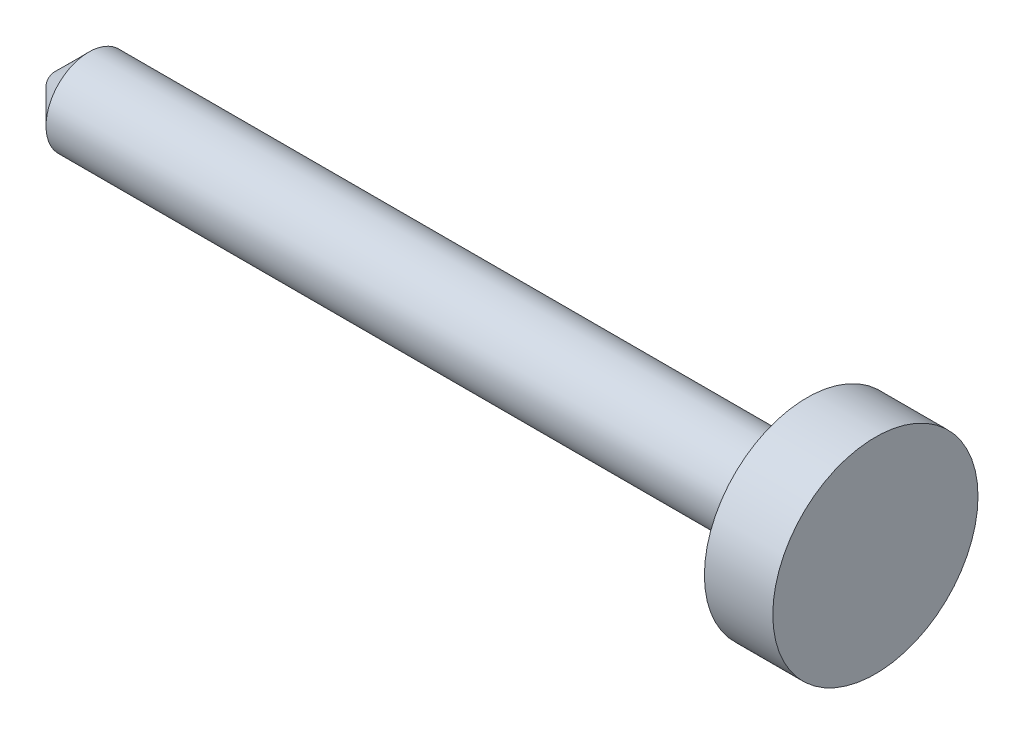
ISO-10303-21;
HEADER;
FILE_DESCRIPTION(('STEP AP214'),'2;1');
FILE_NAME('part.step','',(''),(''),'','','');
FILE_SCHEMA(('AUTOMOTIVE_DESIGN { 1 0 10303 214 1 1 1 1 }'));
ENDSEC;
DATA;
#1=APPLICATION_CONTEXT('core data for automotive mechanical design processes');
#2=APPLICATION_PROTOCOL_DEFINITION('international standard','automotive_design',2000,#1);
#3=PRODUCT_CONTEXT('',#1,'mechanical');
#4=PRODUCT('Part','Part','',(#3));
#5=PRODUCT_RELATED_PRODUCT_CATEGORY('part','',(#4));
#6=PRODUCT_DEFINITION_FORMATION('','',#4);
#7=PRODUCT_DEFINITION_CONTEXT('part definition',#1,'design');
#8=PRODUCT_DEFINITION('design','',#6,#7);
#9=PRODUCT_DEFINITION_SHAPE('','',#8);
#10=(LENGTH_UNIT() NAMED_UNIT(*) SI_UNIT(.MILLI.,.METRE.));
#11=(NAMED_UNIT(*) PLANE_ANGLE_UNIT() SI_UNIT($,.RADIAN.));
#12=(NAMED_UNIT(*) SI_UNIT($,.STERADIAN.) SOLID_ANGLE_UNIT());
#13=UNCERTAINTY_MEASURE_WITH_UNIT(LENGTH_MEASURE(1.E-05),#10,'distance_accuracy_value','');
#14=(GEOMETRIC_REPRESENTATION_CONTEXT(3) GLOBAL_UNCERTAINTY_ASSIGNED_CONTEXT((#13)) GLOBAL_UNIT_ASSIGNED_CONTEXT((#10,
#11,#12)) REPRESENTATION_CONTEXT('',''));
#15=CARTESIAN_POINT('',(0.,0.,0.));
#16=DIRECTION('',(0.,0.,1.));
#17=DIRECTION('',(1.,0.,0.));
#18=AXIS2_PLACEMENT_3D('',#15,#16,#17);
#19=CARTESIAN_POINT('',(-16.462962962963,0.,0.));
#20=DIRECTION('',(1.,0.,0.));
#21=DIRECTION('',(0.,0.,-1.));
#22=AXIS2_PLACEMENT_3D('',#19,#20,#21);
#23=PLANE('',#22);
#24=CARTESIAN_POINT('',(-16.462962962963,0.,0.));
#25=DIRECTION('',(1.,0.,0.));
#26=DIRECTION('',(0.,0.,-1.));
#27=AXIS2_PLACEMENT_3D('',#24,#25,#26);
#28=CIRCLE('',#27,0.249999999999997);
#29=CARTESIAN_POINT('',(-16.462962962963,0.,-0.249999999999995));
#30=VERTEX_POINT('',#29);
#31=EDGE_CURVE('E48',#30,#30,#28,.F.);
#32=ORIENTED_EDGE('',*,*,#31,.T.);
#33=EDGE_LOOP('',(#32));
#34=FACE_BOUND('',#33,.T.);
#35=ADVANCED_FACE('F39',(#34),#23,.F.);
#36=CARTESIAN_POINT('',(-16.462962962963,0.,0.));
#37=DIRECTION('',(-1.,0.,0.));
#38=DIRECTION('',(0.,0.,1.));
#39=AXIS2_PLACEMENT_3D('',#36,#37,#38);
#40=CYLINDRICAL_SURFACE('',#39,1.25);
#41=CARTESIAN_POINT('',(-15.462962962963,0.,0.));
#42=DIRECTION('',(1.,0.,0.));
#43=DIRECTION('',(0.,0.,-1.));
#44=AXIS2_PLACEMENT_3D('',#41,#42,#43);
#45=CIRCLE('',#44,1.25);
#46=CARTESIAN_POINT('',(-15.462962962963,0.,-1.25));
#47=VERTEX_POINT('',#46);
#48=EDGE_CURVE('E10',#47,#47,#45,.T.);
#49=ORIENTED_EDGE('',*,*,#48,.T.);
#50=EDGE_LOOP('',(#49));
#51=FACE_BOUND('',#50,.T.);
#52=CARTESIAN_POINT('',(5.53703703703703,0.,0.));
#53=DIRECTION('',(-1.,0.,0.));
#54=DIRECTION('',(0.,0.,1.));
#55=AXIS2_PLACEMENT_3D('',#52,#53,#54);
#56=CIRCLE('',#55,1.25);
#57=CARTESIAN_POINT('',(5.53703703703703,0.,1.25));
#58=VERTEX_POINT('',#57);
#59=EDGE_CURVE('E53',#58,#58,#56,.T.);
#60=ORIENTED_EDGE('',*,*,#59,.T.);
#61=EDGE_LOOP('',(#60));
#62=FACE_BOUND('',#61,.T.);
#63=ADVANCED_FACE('F83',(#51,#62),#40,.T.);
#64=CARTESIAN_POINT('',(5.53703703703703,1.25,0.));
#65=DIRECTION('',(1.,0.,0.));
#66=DIRECTION('',(0.,0.,-1.));
#67=AXIS2_PLACEMENT_3D('',#64,#65,#66);
#68=PLANE('',#67);
#69=ORIENTED_EDGE('',*,*,#59,.F.);
#70=EDGE_LOOP('',(#69));
#71=FACE_BOUND('',#70,.T.);
#72=CARTESIAN_POINT('',(5.53703703703703,0.,0.));
#73=DIRECTION('',(-1.,0.,0.));
#74=DIRECTION('',(0.,0.,1.));
#75=AXIS2_PLACEMENT_3D('',#72,#73,#74);
#76=CIRCLE('',#75,3.);
#77=CARTESIAN_POINT('',(5.53703703703703,0.,3.));
#78=VERTEX_POINT('',#77);
#79=EDGE_CURVE('E58',#78,#78,#76,.T.);
#80=ORIENTED_EDGE('',*,*,#79,.T.);
#81=EDGE_LOOP('',(#80));
#82=FACE_BOUND('',#81,.T.);
#83=ADVANCED_FACE('F79',(#71,#82),#68,.F.);
#84=CARTESIAN_POINT('',(-16.462962962963,0.,0.));
#85=DIRECTION('',(-1.,0.,0.));
#86=DIRECTION('',(0.,0.,1.));
#87=AXIS2_PLACEMENT_3D('',#84,#85,#86);
#88=CYLINDRICAL_SURFACE('',#87,3.);
#89=ORIENTED_EDGE('',*,*,#79,.F.);
#90=EDGE_LOOP('',(#89));
#91=FACE_BOUND('',#90,.T.);
#92=CARTESIAN_POINT('',(7.53703703703703,0.,0.));
#93=DIRECTION('',(-1.,0.,0.));
#94=DIRECTION('',(0.,0.,1.));
#95=AXIS2_PLACEMENT_3D('',#92,#93,#94);
#96=CIRCLE('',#95,3.);
#97=CARTESIAN_POINT('',(7.53703703703703,0.,3.));
#98=VERTEX_POINT('',#97);
#99=EDGE_CURVE('E64',#98,#98,#96,.T.);
#100=ORIENTED_EDGE('',*,*,#99,.T.);
#101=EDGE_LOOP('',(#100));
#102=FACE_BOUND('',#101,.T.);
#103=ADVANCED_FACE('F69',(#91,#102),#88,.T.);
#104=CARTESIAN_POINT('',(7.53703703703703,3.,0.));
#105=DIRECTION('',(-1.,0.,0.));
#106=DIRECTION('',(0.,0.,1.));
#107=AXIS2_PLACEMENT_3D('',#104,#105,#106);
#108=PLANE('',#107);
#109=ORIENTED_EDGE('',*,*,#99,.F.);
#110=EDGE_LOOP('',(#109));
#111=FACE_BOUND('',#110,.T.);
#112=ADVANCED_FACE('F71',(#111),#108,.F.);
#113=CARTESIAN_POINT('',(-16.462962962963,0.,0.));
#114=DIRECTION('',(1.,0.,0.));
#115=DIRECTION('',(0.,0.,-1.));
#116=AXIS2_PLACEMENT_3D('',#113,#114,#115);
#117=CONICAL_SURFACE('',#116,0.249999999999997,0.785398163397446);
#118=CARTESIAN_POINT('',(-15.462962962963,0.,-1.25));
#119=CARTESIAN_POINT('',(-15.4733796296296,0.,-1.23958333333333));
#120=CARTESIAN_POINT('',(-15.4837962962963,0.,-1.22916666666667));
#121=CARTESIAN_POINT('',(-15.5046296296296,0.,-1.20833333333333));
#122=CARTESIAN_POINT('',(-15.5150462962963,0.,-1.19791666666667));
#123=CARTESIAN_POINT('',(-15.5358796296296,0.,-1.17708333333333));
#124=CARTESIAN_POINT('',(-15.5462962962963,0.,-1.16666666666667));
#125=CARTESIAN_POINT('',(-15.5671296296296,0.,-1.14583333333333));
#126=CARTESIAN_POINT('',(-15.5775462962963,0.,-1.13541666666667));
#127=CARTESIAN_POINT('',(-15.5983796296296,0.,-1.11458333333333));
#128=CARTESIAN_POINT('',(-15.6087962962963,0.,-1.10416666666667));
#129=CARTESIAN_POINT('',(-15.6296296296296,0.,-1.08333333333333));
#130=CARTESIAN_POINT('',(-15.6400462962963,0.,-1.07291666666667));
#131=CARTESIAN_POINT('',(-15.6608796296296,0.,-1.05208333333333));
#132=CARTESIAN_POINT('',(-15.6712962962963,0.,-1.04166666666667));
#133=CARTESIAN_POINT('',(-15.6921296296296,0.,-1.02083333333333));
#134=CARTESIAN_POINT('',(-15.7025462962963,0.,-1.01041666666666));
#135=CARTESIAN_POINT('',(-15.7233796296296,0.,-0.989583333333331));
#136=CARTESIAN_POINT('',(-15.7337962962963,0.,-0.979166666666665));
#137=CARTESIAN_POINT('',(-15.7546296296296,0.,-0.958333333333331));
#138=CARTESIAN_POINT('',(-15.7650462962963,0.,-0.947916666666665));
#139=CARTESIAN_POINT('',(-15.7858796296296,0.,-0.927083333333331));
#140=CARTESIAN_POINT('',(-15.7962962962963,0.,-0.916666666666664));
#141=CARTESIAN_POINT('',(-15.8171296296296,0.,-0.895833333333331));
#142=CARTESIAN_POINT('',(-15.8275462962963,0.,-0.885416666666664));
#143=CARTESIAN_POINT('',(-15.8483796296296,0.,-0.864583333333331));
#144=CARTESIAN_POINT('',(-15.8587962962963,0.,-0.854166666666664));
#145=CARTESIAN_POINT('',(-15.8796296296296,0.,-0.833333333333331));
#146=CARTESIAN_POINT('',(-15.8900462962963,0.,-0.822916666666664));
#147=CARTESIAN_POINT('',(-15.9108796296296,0.,-0.802083333333331));
#148=CARTESIAN_POINT('',(-15.9212962962963,0.,-0.791666666666664));
#149=CARTESIAN_POINT('',(-15.9421296296296,0.,-0.77083333333333));
#150=CARTESIAN_POINT('',(-15.9525462962963,0.,-0.760416666666664));
#151=CARTESIAN_POINT('',(-15.9733796296296,0.,-0.73958333333333));
#152=CARTESIAN_POINT('',(-15.9837962962963,0.,-0.729166666666664));
#153=CARTESIAN_POINT('',(-16.0046296296296,0.,-0.70833333333333));
#154=CARTESIAN_POINT('',(-16.0150462962963,0.,-0.697916666666663));
#155=CARTESIAN_POINT('',(-16.0358796296296,0.,-0.67708333333333));
#156=CARTESIAN_POINT('',(-16.0462962962963,0.,-0.666666666666664));
#157=CARTESIAN_POINT('',(-16.0671296296296,0.,-0.64583333333333));
#158=CARTESIAN_POINT('',(-16.0775462962963,0.,-0.635416666666664));
#159=CARTESIAN_POINT('',(-16.0983796296296,0.,-0.61458333333333));
#160=CARTESIAN_POINT('',(-16.1087962962963,0.,-0.604166666666663));
#161=CARTESIAN_POINT('',(-16.1296296296296,0.,-0.58333333333333));
#162=CARTESIAN_POINT('',(-16.1400462962963,0.,-0.572916666666663));
#163=CARTESIAN_POINT('',(-16.1608796296296,0.,-0.55208333333333));
#164=CARTESIAN_POINT('',(-16.1712962962963,0.,-0.541666666666663));
#165=CARTESIAN_POINT('',(-16.1921296296296,0.,-0.520833333333329));
#166=CARTESIAN_POINT('',(-16.2025462962963,0.,-0.510416666666663));
#167=CARTESIAN_POINT('',(-16.2233796296296,0.,-0.489583333333329));
#168=CARTESIAN_POINT('',(-16.2337962962963,0.,-0.479166666666663));
#169=CARTESIAN_POINT('',(-16.2546296296296,0.,-0.458333333333329));
#170=CARTESIAN_POINT('',(-16.2650462962963,0.,-0.447916666666663));
#171=CARTESIAN_POINT('',(-16.2858796296296,0.,-0.427083333333329));
#172=CARTESIAN_POINT('',(-16.2962962962963,0.,-0.416666666666662));
#173=CARTESIAN_POINT('',(-16.3171296296296,0.,-0.395833333333329));
#174=CARTESIAN_POINT('',(-16.3275462962963,0.,-0.385416666666662));
#175=CARTESIAN_POINT('',(-16.3483796296296,0.,-0.364583333333329));
#176=CARTESIAN_POINT('',(-16.3587962962963,0.,-0.354166666666662));
#177=CARTESIAN_POINT('',(-16.3796296296296,0.,-0.333333333333329));
#178=CARTESIAN_POINT('',(-16.3900462962963,0.,-0.322916666666662));
#179=CARTESIAN_POINT('',(-16.4108796296296,0.,-0.302083333333328));
#180=CARTESIAN_POINT('',(-16.4212962962963,0.,-0.291666666666662));
#181=CARTESIAN_POINT('',(-16.4421296296296,0.,-0.270833333333328));
#182=CARTESIAN_POINT('',(-16.4525462962963,0.,-0.260416666666661));
#183=CARTESIAN_POINT('',(-16.462962962963,0.,-0.249999999999995));
#184=B_SPLINE_CURVE_WITH_KNOTS('',3,(#118,#119,#120,#121,#122,#123,#124,#125,#126,#127,#128,
#129,#130,#131,#132,#133,#134,#135,#136,#137,#138,#139,#140,#141,#142,#143,#144,#145,#146,#147,
#148,#149,#150,#151,#152,#153,#154,#155,#156,#157,#158,#159,#160,#161,#162,#163,#164,#165,#166,
#167,#168,#169,#170,#171,#172,#173,#174,#175,#176,#177,#178,#179,#180,#181,#182,#183),
.UNSPECIFIED.,.F.,.F.,(4,2,2,2,2,2,2,2,2,2,2,2,2,2,2,2,2,2,2,2,2,2,2,2,2,2,2,2,2,2,2,2,4),(0.,
0.0441941738241606,0.0883883476483199,0.132582521472479,0.176776695296639,0.220970869120798,
0.265165042944958,0.309359216769118,0.353553390593277,0.397747564417436,0.441941738241596,
0.486135912065755,0.530330085889914,0.574524259714074,0.618718433538233,0.662912607362392,
0.707106781186552,0.751300955010711,0.79549512883487,0.839689302659032,0.883883476483191,
0.928077650307351,0.97227182413151,1.01646599795567,1.06066017177983,1.10485434560399,
1.14904851942815,1.19324269325231,1.23743686707647,1.28163104090063,1.32582521472478,
1.37001938854894,1.41421356237311),.UNSPECIFIED.);
#185=EDGE_CURVE('BSEAM42',#47,#30,#184,.T.);
#186=ORIENTED_EDGE('',*,*,#48,.F.);
#187=ORIENTED_EDGE('',*,*,#31,.F.);
#188=ORIENTED_EDGE('',*,*,#185,.T.);
#189=ORIENTED_EDGE('',*,*,#185,.F.);
#190=EDGE_LOOP('',(#186,#188,#187,#189));
#191=FACE_BOUND('',#190,.T.);
#192=ADVANCED_FACE('F42',(#191),#117,.T.);
#193=CLOSED_SHELL('',(#35,#63,#83,#103,#112,#192));
#194=MANIFOLD_SOLID_BREP('B2',#193);
#195=ADVANCED_BREP_SHAPE_REPRESENTATION('',(#18,#194),#14);
#196=SHAPE_DEFINITION_REPRESENTATION(#9,#195);
ENDSEC;
END-ISO-10303-21;
